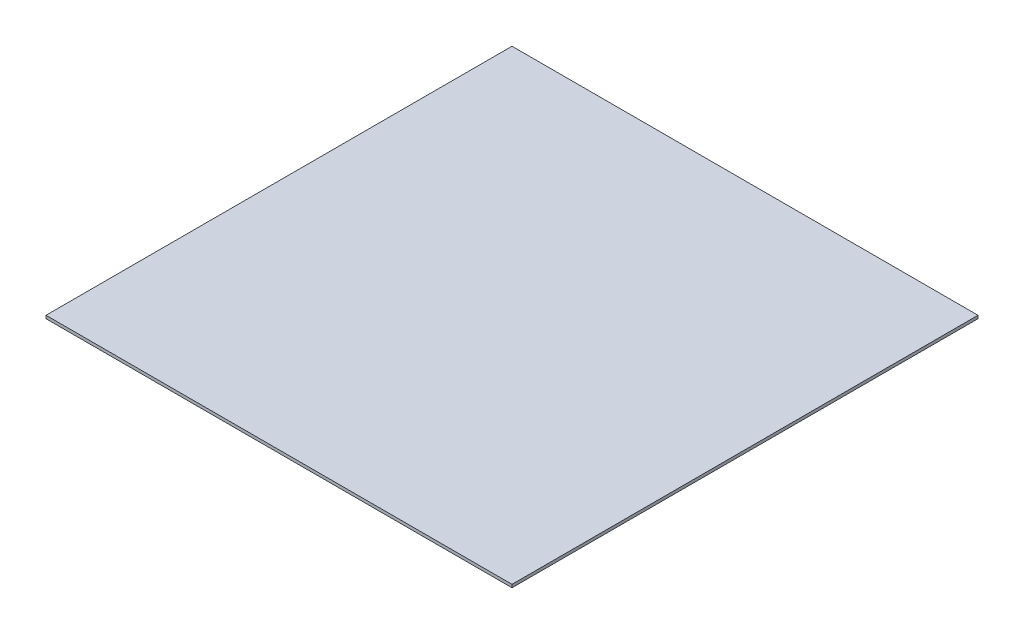
ISO-10303-21;
HEADER;
FILE_DESCRIPTION(('STEP AP214'),'2;1');
FILE_NAME('part.step','',(''),(''),'','','');
FILE_SCHEMA(('AUTOMOTIVE_DESIGN { 1 0 10303 214 1 1 1 1 }'));
ENDSEC;
DATA;
#1=APPLICATION_CONTEXT('core data for automotive mechanical design processes');
#2=APPLICATION_PROTOCOL_DEFINITION('international standard','automotive_design',2000,#1);
#3=PRODUCT_CONTEXT('',#1,'mechanical');
#4=PRODUCT('Part','Part','',(#3));
#5=PRODUCT_RELATED_PRODUCT_CATEGORY('part','',(#4));
#6=PRODUCT_DEFINITION_FORMATION('','',#4);
#7=PRODUCT_DEFINITION_CONTEXT('part definition',#1,'design');
#8=PRODUCT_DEFINITION('design','',#6,#7);
#9=PRODUCT_DEFINITION_SHAPE('','',#8);
#10=(LENGTH_UNIT() NAMED_UNIT(*) SI_UNIT(.MILLI.,.METRE.));
#11=(NAMED_UNIT(*) PLANE_ANGLE_UNIT() SI_UNIT($,.RADIAN.));
#12=(NAMED_UNIT(*) SI_UNIT($,.STERADIAN.) SOLID_ANGLE_UNIT());
#13=UNCERTAINTY_MEASURE_WITH_UNIT(LENGTH_MEASURE(1.E-05),#10,'distance_accuracy_value','');
#14=(GEOMETRIC_REPRESENTATION_CONTEXT(3) GLOBAL_UNCERTAINTY_ASSIGNED_CONTEXT((#13)) GLOBAL_UNIT_ASSIGNED_CONTEXT((#10,
#11,#12)) REPRESENTATION_CONTEXT('',''));
#15=CARTESIAN_POINT('',(0.,0.,0.));
#16=DIRECTION('',(0.,0.,1.));
#17=DIRECTION('',(1.,0.,0.));
#18=AXIS2_PLACEMENT_3D('',#15,#16,#17);
#19=CARTESIAN_POINT('',(155.,2.,-155.));
#20=DIRECTION('',(-1.,0.,0.));
#21=DIRECTION('',(0.,0.,1.));
#22=AXIS2_PLACEMENT_3D('',#19,#20,#21);
#23=PLANE('',#22);
#24=DIRECTION('',(0.,0.,-1.));
#25=VECTOR('',#24,1.);
#26=CARTESIAN_POINT('',(155.,0.,-155.));
#27=LINE('',#26,#25);
#28=CARTESIAN_POINT('',(155.,0.,155.));
#29=VERTEX_POINT('',#28);
#30=CARTESIAN_POINT('',(155.,0.,-155.));
#31=VERTEX_POINT('',#30);
#32=EDGE_CURVE('E95',#29,#31,#27,.T.);
#33=ORIENTED_EDGE('',*,*,#32,.T.);
#34=DIRECTION('',(0.,-1.,0.));
#35=VECTOR('',#34,1.);
#36=CARTESIAN_POINT('',(155.,2.,-155.));
#37=LINE('',#36,#35);
#38=CARTESIAN_POINT('',(155.,2.,-155.));
#39=VERTEX_POINT('',#38);
#40=EDGE_CURVE('E11',#39,#31,#37,.T.);
#41=ORIENTED_EDGE('',*,*,#40,.F.);
#42=DIRECTION('',(0.,0.,-1.));
#43=VECTOR('',#42,1.);
#44=CARTESIAN_POINT('',(155.,2.,-155.));
#45=LINE('',#44,#43);
#46=CARTESIAN_POINT('',(155.,2.,155.));
#47=VERTEX_POINT('',#46);
#48=EDGE_CURVE('E83',#47,#39,#45,.T.);
#49=ORIENTED_EDGE('',*,*,#48,.F.);
#50=DIRECTION('',(0.,-1.,0.));
#51=VECTOR('',#50,1.);
#52=CARTESIAN_POINT('',(155.,2.,155.));
#53=LINE('',#52,#51);
#54=EDGE_CURVE('E91',#47,#29,#53,.T.);
#55=ORIENTED_EDGE('',*,*,#54,.T.);
#56=EDGE_LOOP('',(#33,#41,#49,#55));
#57=FACE_BOUND('',#56,.T.);
#58=ADVANCED_FACE('F32',(#57),#23,.F.);
#59=CARTESIAN_POINT('',(-155.,2.,-155.));
#60=DIRECTION('',(0.,0.,1.));
#61=DIRECTION('',(1.,0.,0.));
#62=AXIS2_PLACEMENT_3D('',#59,#60,#61);
#63=PLANE('',#62);
#64=DIRECTION('',(-1.,0.,0.));
#65=VECTOR('',#64,1.);
#66=CARTESIAN_POINT('',(-155.,0.,-155.));
#67=LINE('',#66,#65);
#68=CARTESIAN_POINT('',(-155.,0.,-155.));
#69=VERTEX_POINT('',#68);
#70=EDGE_CURVE('E87',#31,#69,#67,.T.);
#71=ORIENTED_EDGE('',*,*,#70,.T.);
#72=DIRECTION('',(0.,-1.,0.));
#73=VECTOR('',#72,1.);
#74=CARTESIAN_POINT('',(-155.,2.,-155.));
#75=LINE('',#74,#73);
#76=CARTESIAN_POINT('',(-155.,2.,-155.));
#77=VERTEX_POINT('',#76);
#78=EDGE_CURVE('E40',#77,#69,#75,.T.);
#79=ORIENTED_EDGE('',*,*,#78,.F.);
#80=DIRECTION('',(-1.,0.,0.));
#81=VECTOR('',#80,1.);
#82=CARTESIAN_POINT('',(-155.,2.,-155.));
#83=LINE('',#82,#81);
#84=EDGE_CURVE('E78',#39,#77,#83,.T.);
#85=ORIENTED_EDGE('',*,*,#84,.F.);
#86=ORIENTED_EDGE('',*,*,#40,.T.);
#87=EDGE_LOOP('',(#71,#79,#85,#86));
#88=FACE_BOUND('',#87,.T.);
#89=ADVANCED_FACE('F86',(#88),#63,.F.);
#90=CARTESIAN_POINT('',(-155.,2.,-155.));
#91=DIRECTION('',(1.,0.,0.));
#92=DIRECTION('',(0.,0.,-1.));
#93=AXIS2_PLACEMENT_3D('',#90,#91,#92);
#94=PLANE('',#93);
#95=DIRECTION('',(0.,0.,1.));
#96=VECTOR('',#95,1.);
#97=CARTESIAN_POINT('',(-155.,0.,-155.));
#98=LINE('',#97,#96);
#99=CARTESIAN_POINT('',(-155.,0.,155.));
#100=VERTEX_POINT('',#99);
#101=EDGE_CURVE('E65',#69,#100,#98,.T.);
#102=ORIENTED_EDGE('',*,*,#101,.T.);
#103=DIRECTION('',(0.,-1.,0.));
#104=VECTOR('',#103,1.);
#105=CARTESIAN_POINT('',(-155.,2.,155.));
#106=LINE('',#105,#104);
#107=CARTESIAN_POINT('',(-155.,2.,155.));
#108=VERTEX_POINT('',#107);
#109=EDGE_CURVE('E88',#108,#100,#106,.T.);
#110=ORIENTED_EDGE('',*,*,#109,.F.);
#111=DIRECTION('',(0.,0.,1.));
#112=VECTOR('',#111,1.);
#113=CARTESIAN_POINT('',(-155.,2.,-155.));
#114=LINE('',#113,#112);
#115=EDGE_CURVE('E81',#77,#108,#114,.T.);
#116=ORIENTED_EDGE('',*,*,#115,.F.);
#117=ORIENTED_EDGE('',*,*,#78,.T.);
#118=EDGE_LOOP('',(#102,#110,#116,#117));
#119=FACE_BOUND('',#118,.T.);
#120=ADVANCED_FACE('F89',(#119),#94,.F.);
#121=CARTESIAN_POINT('',(-155.,2.,155.));
#122=DIRECTION('',(0.,0.,-1.));
#123=DIRECTION('',(-1.,0.,0.));
#124=AXIS2_PLACEMENT_3D('',#121,#122,#123);
#125=PLANE('',#124);
#126=DIRECTION('',(1.,0.,0.));
#127=VECTOR('',#126,1.);
#128=CARTESIAN_POINT('',(-155.,0.,155.));
#129=LINE('',#128,#127);
#130=EDGE_CURVE('E71',#100,#29,#129,.T.);
#131=ORIENTED_EDGE('',*,*,#130,.T.);
#132=ORIENTED_EDGE('',*,*,#54,.F.);
#133=DIRECTION('',(1.,0.,0.));
#134=VECTOR('',#133,1.);
#135=CARTESIAN_POINT('',(-155.,2.,155.));
#136=LINE('',#135,#134);
#137=EDGE_CURVE('E48',#108,#47,#136,.T.);
#138=ORIENTED_EDGE('',*,*,#137,.F.);
#139=ORIENTED_EDGE('',*,*,#109,.T.);
#140=EDGE_LOOP('',(#131,#132,#138,#139));
#141=FACE_BOUND('',#140,.T.);
#142=ADVANCED_FACE('F102',(#141),#125,.F.);
#143=CARTESIAN_POINT('',(0.,2.,0.));
#144=DIRECTION('',(0.,1.,0.));
#145=DIRECTION('',(0.,0.,1.));
#146=AXIS2_PLACEMENT_3D('',#143,#144,#145);
#147=PLANE('',#146);
#148=ORIENTED_EDGE('',*,*,#48,.T.);
#149=ORIENTED_EDGE('',*,*,#84,.T.);
#150=ORIENTED_EDGE('',*,*,#115,.T.);
#151=ORIENTED_EDGE('',*,*,#137,.T.);
#152=EDGE_LOOP('',(#148,#149,#150,#151));
#153=FACE_BOUND('',#152,.T.);
#154=ADVANCED_FACE('F79',(#153),#147,.T.);
#155=CARTESIAN_POINT('',(0.,0.,0.));
#156=DIRECTION('',(0.,1.,0.));
#157=DIRECTION('',(0.,0.,1.));
#158=AXIS2_PLACEMENT_3D('',#155,#156,#157);
#159=PLANE('',#158);
#160=ORIENTED_EDGE('',*,*,#32,.F.);
#161=ORIENTED_EDGE('',*,*,#130,.F.);
#162=ORIENTED_EDGE('',*,*,#101,.F.);
#163=ORIENTED_EDGE('',*,*,#70,.F.);
#164=EDGE_LOOP('',(#160,#161,#162,#163));
#165=FACE_BOUND('',#164,.T.);
#166=ADVANCED_FACE('F105',(#165),#159,.F.);
#167=CLOSED_SHELL('',(#58,#89,#120,#142,#154,#166));
#168=MANIFOLD_SOLID_BREP('B2',#167);
#169=ADVANCED_BREP_SHAPE_REPRESENTATION('',(#18,#168),#14);
#170=SHAPE_DEFINITION_REPRESENTATION(#9,#169);
ENDSEC;
END-ISO-10303-21;
